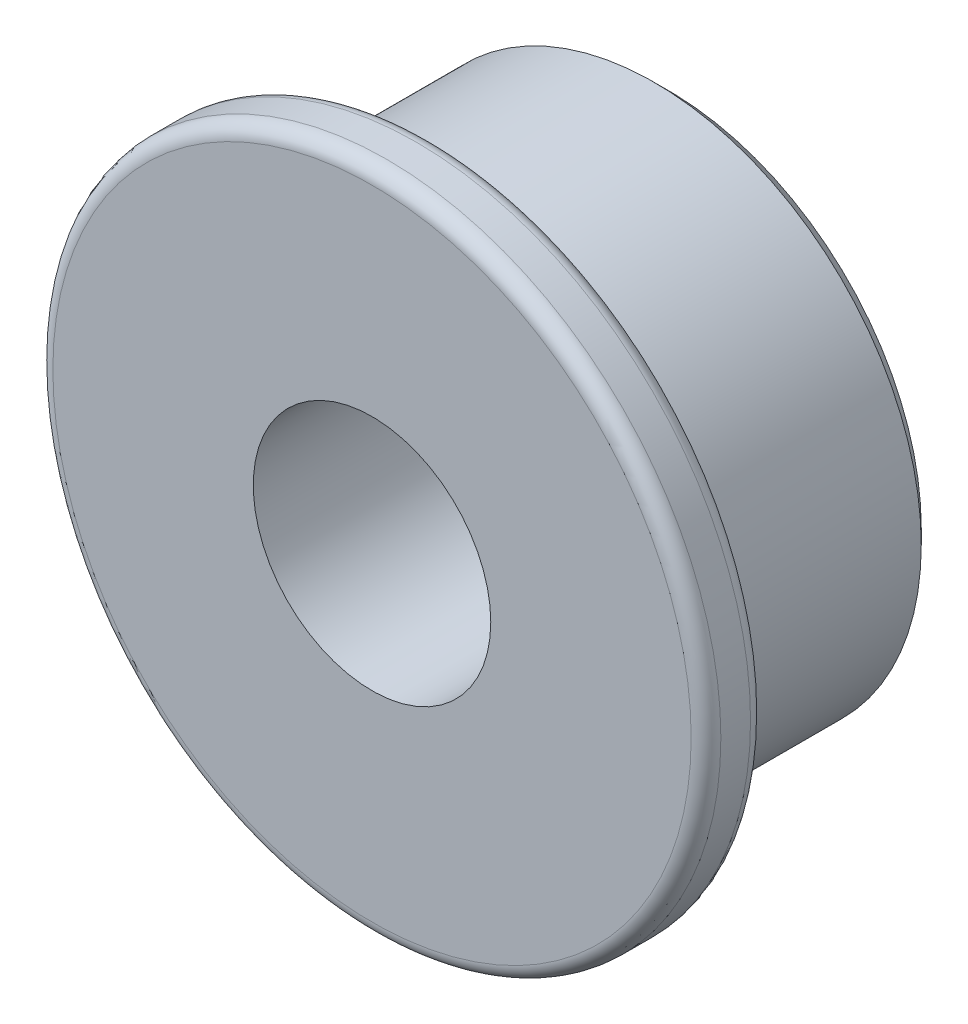
ISO-10303-21;
HEADER;
FILE_DESCRIPTION(('STEP AP214'),'2;1');
FILE_NAME('part.step','',(''),(''),'','','');
FILE_SCHEMA(('AUTOMOTIVE_DESIGN { 1 0 10303 214 1 1 1 1 }'));
ENDSEC;
DATA;
#1=APPLICATION_CONTEXT('core data for automotive mechanical design processes');
#2=APPLICATION_PROTOCOL_DEFINITION('international standard','automotive_design',2000,#1);
#3=PRODUCT_CONTEXT('',#1,'mechanical');
#4=PRODUCT('Part','Part','',(#3));
#5=PRODUCT_RELATED_PRODUCT_CATEGORY('part','',(#4));
#6=PRODUCT_DEFINITION_FORMATION('','',#4);
#7=PRODUCT_DEFINITION_CONTEXT('part definition',#1,'design');
#8=PRODUCT_DEFINITION('design','',#6,#7);
#9=PRODUCT_DEFINITION_SHAPE('','',#8);
#10=(LENGTH_UNIT() NAMED_UNIT(*) SI_UNIT(.MILLI.,.METRE.));
#11=(NAMED_UNIT(*) PLANE_ANGLE_UNIT() SI_UNIT($,.RADIAN.));
#12=(NAMED_UNIT(*) SI_UNIT($,.STERADIAN.) SOLID_ANGLE_UNIT());
#13=UNCERTAINTY_MEASURE_WITH_UNIT(LENGTH_MEASURE(1.E-05),#10,'distance_accuracy_value','');
#14=(GEOMETRIC_REPRESENTATION_CONTEXT(3) GLOBAL_UNCERTAINTY_ASSIGNED_CONTEXT((#13)) GLOBAL_UNIT_ASSIGNED_CONTEXT((#10,
#11,#12)) REPRESENTATION_CONTEXT('',''));
#15=CARTESIAN_POINT('',(0.,0.,0.));
#16=DIRECTION('',(0.,0.,1.));
#17=DIRECTION('',(1.,0.,0.));
#18=AXIS2_PLACEMENT_3D('',#15,#16,#17);
#19=CARTESIAN_POINT('',(0.,0.,-8.));
#20=DIRECTION('',(0.,0.,1.));
#21=DIRECTION('',(1.,0.,0.));
#22=AXIS2_PLACEMENT_3D('',#19,#20,#21);
#23=CYLINDRICAL_SURFACE('',#22,9.);
#24=CARTESIAN_POINT('',(0.,0.,-7.49999999999999));
#25=DIRECTION('',(0.,0.,1.));
#26=DIRECTION('',(1.,0.,0.));
#27=AXIS2_PLACEMENT_3D('',#24,#25,#26);
#28=CIRCLE('',#27,9.);
#29=CARTESIAN_POINT('',(9.,0.,-7.49999999999999));
#30=VERTEX_POINT('',#29);
#31=EDGE_CURVE('E54',#30,#30,#28,.T.);
#32=ORIENTED_EDGE('',*,*,#31,.T.);
#33=EDGE_LOOP('',(#32));
#34=FACE_BOUND('',#33,.T.);
#35=CARTESIAN_POINT('',(0.,0.,-0.8));
#36=DIRECTION('',(0.,0.,1.));
#37=DIRECTION('',(1.,0.,0.));
#38=AXIS2_PLACEMENT_3D('',#35,#36,#37);
#39=CIRCLE('',#38,9.);
#40=CARTESIAN_POINT('',(9.,0.,-0.8));
#41=VERTEX_POINT('',#40);
#42=EDGE_CURVE('E59',#41,#41,#39,.F.);
#43=ORIENTED_EDGE('',*,*,#42,.T.);
#44=EDGE_LOOP('',(#43));
#45=FACE_BOUND('',#44,.T.);
#46=ADVANCED_FACE('F45',(#34,#45),#23,.T.);
#47=CARTESIAN_POINT('',(0.,0.,-8.));
#48=DIRECTION('',(0.,0.,1.));
#49=DIRECTION('',(1.,0.,0.));
#50=AXIS2_PLACEMENT_3D('',#47,#48,#49);
#51=PLANE('',#50);
#52=CARTESIAN_POINT('',(0.,0.,-8.));
#53=DIRECTION('',(0.,0.,1.));
#54=DIRECTION('',(1.,0.,0.));
#55=AXIS2_PLACEMENT_3D('',#52,#53,#54);
#56=CIRCLE('',#55,8.49999999999999);
#57=CARTESIAN_POINT('',(8.49999999999999,0.,-8.));
#58=VERTEX_POINT('',#57);
#59=EDGE_CURVE('E10',#58,#58,#56,.F.);
#60=ORIENTED_EDGE('',*,*,#59,.T.);
#61=EDGE_LOOP('',(#60));
#62=FACE_BOUND('',#61,.T.);
#63=CARTESIAN_POINT('',(0.,0.,-8.));
#64=DIRECTION('',(0.,0.,1.));
#65=DIRECTION('',(1.,0.,0.));
#66=AXIS2_PLACEMENT_3D('',#63,#64,#65);
#67=CIRCLE('',#66,4.);
#68=CARTESIAN_POINT('',(4.,0.,-8.));
#69=VERTEX_POINT('',#68);
#70=EDGE_CURVE('E86',#69,#69,#67,.T.);
#71=ORIENTED_EDGE('',*,*,#70,.T.);
#72=EDGE_LOOP('',(#71));
#73=FACE_BOUND('',#72,.T.);
#74=ADVANCED_FACE('F110',(#62,#73),#51,.F.);
#75=CARTESIAN_POINT('',(0.,0.,-8.));
#76=DIRECTION('',(0.,0.,1.));
#77=DIRECTION('',(1.,0.,0.));
#78=AXIS2_PLACEMENT_3D('',#75,#76,#77);
#79=CYLINDRICAL_SURFACE('',#78,4.);
#80=ORIENTED_EDGE('',*,*,#70,.F.);
#81=EDGE_LOOP('',(#80));
#82=FACE_BOUND('',#81,.T.);
#83=CARTESIAN_POINT('',(0.,0.,2.));
#84=DIRECTION('',(0.,0.,1.));
#85=DIRECTION('',(1.,0.,0.));
#86=AXIS2_PLACEMENT_3D('',#83,#84,#85);
#87=CIRCLE('',#86,4.);
#88=CARTESIAN_POINT('',(4.,0.,2.));
#89=VERTEX_POINT('',#88);
#90=EDGE_CURVE('E90',#89,#89,#87,.T.);
#91=ORIENTED_EDGE('',*,*,#90,.T.);
#92=EDGE_LOOP('',(#91));
#93=FACE_BOUND('',#92,.T.);
#94=ADVANCED_FACE('F95',(#82,#93),#79,.F.);
#95=CARTESIAN_POINT('',(0.,0.,2.));
#96=DIRECTION('',(0.,0.,1.));
#97=DIRECTION('',(1.,0.,0.));
#98=AXIS2_PLACEMENT_3D('',#95,#96,#97);
#99=PLANE('',#98);
#100=CARTESIAN_POINT('',(0.,0.,2.));
#101=DIRECTION('',(0.,0.,1.));
#102=DIRECTION('',(1.,0.,0.));
#103=AXIS2_PLACEMENT_3D('',#100,#101,#102);
#104=CIRCLE('',#103,10.75);
#105=CARTESIAN_POINT('',(10.75,0.,2.));
#106=VERTEX_POINT('',#105);
#107=EDGE_CURVE('E82',#106,#106,#104,.T.);
#108=ORIENTED_EDGE('',*,*,#107,.T.);
#109=EDGE_LOOP('',(#108));
#110=FACE_BOUND('',#109,.T.);
#111=ORIENTED_EDGE('',*,*,#90,.F.);
#112=EDGE_LOOP('',(#111));
#113=FACE_BOUND('',#112,.T.);
#114=ADVANCED_FACE('F97',(#110,#113),#99,.T.);
#115=CARTESIAN_POINT('',(0.,0.,0.));
#116=DIRECTION('',(0.,0.,1.));
#117=DIRECTION('',(1.,0.,0.));
#118=AXIS2_PLACEMENT_3D('',#115,#116,#117);
#119=PLANE('',#118);
#120=CARTESIAN_POINT('',(0.,0.,0.));
#121=DIRECTION('',(0.,0.,1.));
#122=DIRECTION('',(1.,0.,0.));
#123=AXIS2_PLACEMENT_3D('',#120,#121,#122);
#124=CIRCLE('',#123,9.8);
#125=CARTESIAN_POINT('',(9.8,0.,0.));
#126=VERTEX_POINT('',#125);
#127=EDGE_CURVE('E64',#126,#126,#124,.T.);
#128=ORIENTED_EDGE('',*,*,#127,.T.);
#129=EDGE_LOOP('',(#128));
#130=FACE_BOUND('',#129,.T.);
#131=CARTESIAN_POINT('',(0.,0.,0.));
#132=DIRECTION('',(0.,0.,1.));
#133=DIRECTION('',(1.,0.,0.));
#134=AXIS2_PLACEMENT_3D('',#131,#132,#133);
#135=CIRCLE('',#134,10.75);
#136=CARTESIAN_POINT('',(10.75,0.,0.));
#137=VERTEX_POINT('',#136);
#138=EDGE_CURVE('E70',#137,#137,#135,.F.);
#139=ORIENTED_EDGE('',*,*,#138,.T.);
#140=EDGE_LOOP('',(#139));
#141=FACE_BOUND('',#140,.T.);
#142=ADVANCED_FACE('F99',(#130,#141),#119,.F.);
#143=CARTESIAN_POINT('',(0.,0.,2.));
#144=DIRECTION('',(0.,0.,-1.));
#145=DIRECTION('',(-1.,0.,0.));
#146=AXIS2_PLACEMENT_3D('',#143,#144,#145);
#147=CYLINDRICAL_SURFACE('',#146,11.25);
#148=CARTESIAN_POINT('',(0.,0.,0.5));
#149=DIRECTION('',(0.,0.,1.));
#150=DIRECTION('',(1.,0.,0.));
#151=AXIS2_PLACEMENT_3D('',#148,#149,#150);
#152=CIRCLE('',#151,11.25);
#153=CARTESIAN_POINT('',(11.25,0.,0.5));
#154=VERTEX_POINT('',#153);
#155=EDGE_CURVE('E74',#154,#154,#152,.T.);
#156=ORIENTED_EDGE('',*,*,#155,.T.);
#157=EDGE_LOOP('',(#156));
#158=FACE_BOUND('',#157,.T.);
#159=CARTESIAN_POINT('',(0.,0.,1.5));
#160=DIRECTION('',(0.,0.,1.));
#161=DIRECTION('',(1.,0.,0.));
#162=AXIS2_PLACEMENT_3D('',#159,#160,#161);
#163=CIRCLE('',#162,11.25);
#164=CARTESIAN_POINT('',(11.25,0.,1.5));
#165=VERTEX_POINT('',#164);
#166=EDGE_CURVE('E78',#165,#165,#163,.F.);
#167=ORIENTED_EDGE('',*,*,#166,.T.);
#168=EDGE_LOOP('',(#167));
#169=FACE_BOUND('',#168,.T.);
#170=ADVANCED_FACE('F107',(#158,#169),#147,.T.);
#171=CARTESIAN_POINT('',(0.,0.,1.5));
#172=DIRECTION('',(0.,0.,1.));
#173=DIRECTION('',(1.,0.,0.));
#174=AXIS2_PLACEMENT_3D('',#171,#172,#173);
#175=TOROIDAL_SURFACE('',#174,10.75,0.5);
#176=ORIENTED_EDGE('',*,*,#166,.F.);
#177=EDGE_LOOP('',(#176));
#178=FACE_BOUND('',#177,.T.);
#179=ORIENTED_EDGE('',*,*,#107,.F.);
#180=EDGE_LOOP('',(#179));
#181=FACE_BOUND('',#180,.T.);
#182=ADVANCED_FACE('F122',(#178,#181),#175,.T.);
#183=CARTESIAN_POINT('',(0.,0.,0.5));
#184=DIRECTION('',(0.,0.,1.));
#185=DIRECTION('',(1.,0.,0.));
#186=AXIS2_PLACEMENT_3D('',#183,#184,#185);
#187=TOROIDAL_SURFACE('',#186,10.75,0.5);
#188=ORIENTED_EDGE('',*,*,#138,.F.);
#189=EDGE_LOOP('',(#188));
#190=FACE_BOUND('',#189,.T.);
#191=ORIENTED_EDGE('',*,*,#155,.F.);
#192=EDGE_LOOP('',(#191));
#193=FACE_BOUND('',#192,.T.);
#194=ADVANCED_FACE('F124',(#190,#193),#187,.T.);
#195=CARTESIAN_POINT('',(0.,0.,-0.8));
#196=DIRECTION('',(0.,0.,1.));
#197=DIRECTION('',(1.,0.,0.));
#198=AXIS2_PLACEMENT_3D('',#195,#196,#197);
#199=TOROIDAL_SURFACE('',#198,9.8,0.8);
#200=ORIENTED_EDGE('',*,*,#42,.F.);
#201=EDGE_LOOP('',(#200));
#202=FACE_BOUND('',#201,.T.);
#203=ORIENTED_EDGE('',*,*,#127,.F.);
#204=EDGE_LOOP('',(#203));
#205=FACE_BOUND('',#204,.T.);
#206=ADVANCED_FACE('F127',(#202,#205),#199,.F.);
#207=CARTESIAN_POINT('',(0.,0.,-7.49999999999999));
#208=DIRECTION('',(0.,0.,1.));
#209=DIRECTION('',(1.,0.,0.));
#210=AXIS2_PLACEMENT_3D('',#207,#208,#209);
#211=CONICAL_SURFACE('',#210,9.,0.78539816339745);
#212=ORIENTED_EDGE('',*,*,#59,.F.);
#213=EDGE_LOOP('',(#212));
#214=FACE_BOUND('',#213,.T.);
#215=ORIENTED_EDGE('',*,*,#31,.F.);
#216=EDGE_LOOP('',(#215));
#217=FACE_BOUND('',#216,.T.);
#218=ADVANCED_FACE('F48',(#214,#217),#211,.T.);
#219=CLOSED_SHELL('',(#46,#74,#94,#114,#142,#170,#182,#194,#206,#218));
#220=MANIFOLD_SOLID_BREP('B2',#219);
#221=ADVANCED_BREP_SHAPE_REPRESENTATION('',(#18,#220),#14);
#222=SHAPE_DEFINITION_REPRESENTATION(#9,#221);
ENDSEC;
END-ISO-10303-21;
